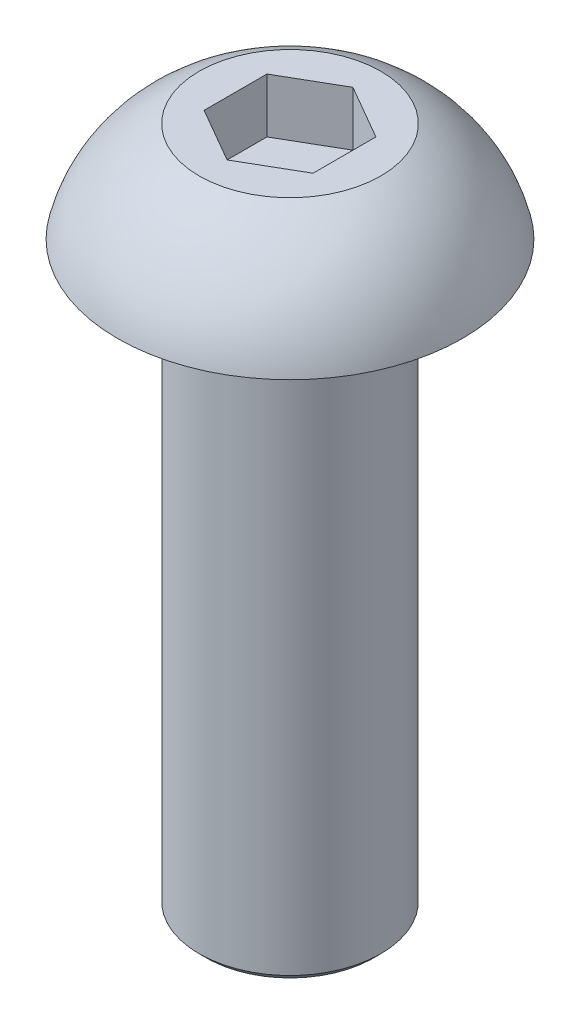
ISO-10303-21;
HEADER;
FILE_DESCRIPTION(('STEP AP214'),'2;1');
FILE_NAME('part.step','',(''),(''),'','','');
FILE_SCHEMA(('AUTOMOTIVE_DESIGN { 1 0 10303 214 1 1 1 1 }'));
ENDSEC;
DATA;
#1=APPLICATION_CONTEXT('core data for automotive mechanical design processes');
#2=APPLICATION_PROTOCOL_DEFINITION('international standard','automotive_design',2000,#1);
#3=PRODUCT_CONTEXT('',#1,'mechanical');
#4=PRODUCT('Part','Part','',(#3));
#5=PRODUCT_RELATED_PRODUCT_CATEGORY('part','',(#4));
#6=PRODUCT_DEFINITION_FORMATION('','',#4);
#7=PRODUCT_DEFINITION_CONTEXT('part definition',#1,'design');
#8=PRODUCT_DEFINITION('design','',#6,#7);
#9=PRODUCT_DEFINITION_SHAPE('','',#8);
#10=(LENGTH_UNIT() NAMED_UNIT(*) SI_UNIT(.MILLI.,.METRE.));
#11=(NAMED_UNIT(*) PLANE_ANGLE_UNIT() SI_UNIT($,.RADIAN.));
#12=(NAMED_UNIT(*) SI_UNIT($,.STERADIAN.) SOLID_ANGLE_UNIT());
#13=UNCERTAINTY_MEASURE_WITH_UNIT(LENGTH_MEASURE(1.E-05),#10,'distance_accuracy_value','');
#14=(GEOMETRIC_REPRESENTATION_CONTEXT(3) GLOBAL_UNCERTAINTY_ASSIGNED_CONTEXT((#13)) GLOBAL_UNIT_ASSIGNED_CONTEXT((#10,
#11,#12)) REPRESENTATION_CONTEXT('',''));
#15=CARTESIAN_POINT('',(0.,0.,0.));
#16=DIRECTION('',(0.,0.,1.));
#17=DIRECTION('',(1.,0.,0.));
#18=AXIS2_PLACEMENT_3D('',#15,#16,#17);
#19=CARTESIAN_POINT('',(0.,2.75,0.));
#20=DIRECTION('',(0.,1.,0.));
#21=DIRECTION('',(0.,0.,1.));
#22=AXIS2_PLACEMENT_3D('',#19,#20,#21);
#23=PLANE('',#22);
#24=DIRECTION('',(-0.866025403784439,0.,0.5));
#25=VECTOR('',#24,1.);
#26=CARTESIAN_POINT('',(0.,2.75,-1.73205080756887));
#27=LINE('',#26,#25);
#28=CARTESIAN_POINT('',(0.,2.75,-1.73205080756887));
#29=VERTEX_POINT('',#28);
#30=CARTESIAN_POINT('',(-1.5,2.75,-0.866025403784439));
#31=VERTEX_POINT('',#30);
#32=EDGE_CURVE('E32',#29,#31,#27,.T.);
#33=ORIENTED_EDGE('',*,*,#32,.F.);
#34=DIRECTION('',(-0.866025403784439,0.,-0.5));
#35=VECTOR('',#34,1.);
#36=CARTESIAN_POINT('',(1.5,2.75,-0.866025403784439));
#37=LINE('',#36,#35);
#38=CARTESIAN_POINT('',(1.5,2.75,-0.866025403784439));
#39=VERTEX_POINT('',#38);
#40=EDGE_CURVE('E115',#39,#29,#37,.T.);
#41=ORIENTED_EDGE('',*,*,#40,.F.);
#42=DIRECTION('',(0.,0.,-1.));
#43=VECTOR('',#42,1.);
#44=CARTESIAN_POINT('',(1.5,2.75,0.866025403784438));
#45=LINE('',#44,#43);
#46=CARTESIAN_POINT('',(1.5,2.75,0.866025403784438));
#47=VERTEX_POINT('',#46);
#48=EDGE_CURVE('E113',#47,#39,#45,.T.);
#49=ORIENTED_EDGE('',*,*,#48,.F.);
#50=DIRECTION('',(0.866025403784439,0.,-0.5));
#51=VECTOR('',#50,1.);
#52=CARTESIAN_POINT('',(0.,2.75,1.73205080756887));
#53=LINE('',#52,#51);
#54=CARTESIAN_POINT('',(0.,2.75,1.73205080756887));
#55=VERTEX_POINT('',#54);
#56=EDGE_CURVE('E80',#55,#47,#53,.T.);
#57=ORIENTED_EDGE('',*,*,#56,.F.);
#58=DIRECTION('',(0.866025403784439,0.,0.5));
#59=VECTOR('',#58,1.);
#60=CARTESIAN_POINT('',(-1.5,2.75,0.866025403784439));
#61=LINE('',#60,#59);
#62=CARTESIAN_POINT('',(-1.5,2.75,0.866025403784439));
#63=VERTEX_POINT('',#62);
#64=EDGE_CURVE('E109',#63,#55,#61,.T.);
#65=ORIENTED_EDGE('',*,*,#64,.F.);
#66=DIRECTION('',(0.,0.,1.));
#67=VECTOR('',#66,1.);
#68=CARTESIAN_POINT('',(-1.5,2.75,-0.866025403784439));
#69=LINE('',#68,#67);
#70=EDGE_CURVE('E106',#31,#63,#69,.T.);
#71=ORIENTED_EDGE('',*,*,#70,.F.);
#72=EDGE_LOOP('',(#33,#41,#49,#57,#65,#71));
#73=FACE_BOUND('',#72,.T.);
#74=CARTESIAN_POINT('',(0.,2.75,0.));
#75=DIRECTION('',(0.,1.,0.));
#76=DIRECTION('',(0.,0.,1.));
#77=AXIS2_PLACEMENT_3D('',#74,#75,#76);
#78=CIRCLE('',#77,2.5);
#79=CARTESIAN_POINT('',(0.,2.75,2.5));
#80=VERTEX_POINT('',#79);
#81=EDGE_CURVE('E130',#80,#80,#78,.T.);
#82=ORIENTED_EDGE('',*,*,#81,.T.);
#83=EDGE_LOOP('',(#82));
#84=FACE_BOUND('',#83,.T.);
#85=ADVANCED_FACE('F17',(#73,#84),#23,.T.);
#86=CARTESIAN_POINT('',(0.,-0.894408862271936,0.));
#87=DIRECTION('',(0.,1.,0.));
#88=DIRECTION('',(0.,0.,1.));
#89=AXIS2_PLACEMENT_3D('',#86,#87,#88);
#90=DEGENERATE_TOROIDAL_SURFACE('',#89,0.851278057223178,4.,.T.);
#91=CARTESIAN_POINT('',(0.,0.,0.));
#92=DIRECTION('',(0.,1.,0.));
#93=DIRECTION('',(0.,0.,1.));
#94=AXIS2_PLACEMENT_3D('',#91,#92,#93);
#95=CIRCLE('',#94,4.75);
#96=CARTESIAN_POINT('',(0.,0.,4.75));
#97=VERTEX_POINT('',#96);
#98=EDGE_CURVE('E127',#97,#97,#95,.T.);
#99=ORIENTED_EDGE('',*,*,#98,.T.);
#100=EDGE_LOOP('',(#99));
#101=FACE_BOUND('',#100,.T.);
#102=ORIENTED_EDGE('',*,*,#81,.F.);
#103=EDGE_LOOP('',(#102));
#104=FACE_BOUND('',#103,.T.);
#105=ADVANCED_FACE('F149',(#101,#104),#90,.T.);
#106=CARTESIAN_POINT('',(-2.5,0.,0.));
#107=DIRECTION('',(0.,-1.,0.));
#108=DIRECTION('',(0.,0.,-1.));
#109=AXIS2_PLACEMENT_3D('',#106,#107,#108);
#110=PLANE('',#109);
#111=CARTESIAN_POINT('',(0.,0.,0.));
#112=DIRECTION('',(0.,1.,0.));
#113=DIRECTION('',(0.,0.,1.));
#114=AXIS2_PLACEMENT_3D('',#111,#112,#113);
#115=CIRCLE('',#114,2.5);
#116=CARTESIAN_POINT('',(0.,0.,2.5));
#117=VERTEX_POINT('',#116);
#118=EDGE_CURVE('E119',#117,#117,#115,.T.);
#119=ORIENTED_EDGE('',*,*,#118,.T.);
#120=EDGE_LOOP('',(#119));
#121=FACE_BOUND('',#120,.T.);
#122=ORIENTED_EDGE('',*,*,#98,.F.);
#123=EDGE_LOOP('',(#122));
#124=FACE_BOUND('',#123,.T.);
#125=ADVANCED_FACE('F155',(#121,#124),#110,.T.);
#126=CARTESIAN_POINT('',(0.,60.1595545799248,0.));
#127=DIRECTION('',(0.,1.,0.));
#128=DIRECTION('',(0.,0.,1.));
#129=AXIS2_PLACEMENT_3D('',#126,#127,#128);
#130=CYLINDRICAL_SURFACE('',#129,2.5);
#131=CARTESIAN_POINT('',(0.,-15.8,0.));
#132=DIRECTION('',(0.,-1.,0.));
#133=DIRECTION('',(0.,0.,-1.));
#134=AXIS2_PLACEMENT_3D('',#131,#132,#133);
#135=CIRCLE('',#134,2.5);
#136=CARTESIAN_POINT('',(0.,-15.8,-2.5));
#137=VERTEX_POINT('',#136);
#138=EDGE_CURVE('E25',#137,#137,#135,.F.);
#139=ORIENTED_EDGE('',*,*,#138,.T.);
#140=EDGE_LOOP('',(#139));
#141=FACE_BOUND('',#140,.T.);
#142=ORIENTED_EDGE('',*,*,#118,.F.);
#143=EDGE_LOOP('',(#142));
#144=FACE_BOUND('',#143,.T.);
#145=ADVANCED_FACE('F135',(#141,#144),#130,.T.);
#146=CARTESIAN_POINT('',(0.,-16.,0.));
#147=DIRECTION('',(0.,-1.,0.));
#148=DIRECTION('',(0.,0.,-1.));
#149=AXIS2_PLACEMENT_3D('',#146,#147,#148);
#150=PLANE('',#149);
#151=CARTESIAN_POINT('',(0.,-16.,0.));
#152=DIRECTION('',(0.,-1.,0.));
#153=DIRECTION('',(0.,0.,-1.));
#154=AXIS2_PLACEMENT_3D('',#151,#152,#153);
#155=CIRCLE('',#154,2.3);
#156=CARTESIAN_POINT('',(0.,-16.,-2.3));
#157=VERTEX_POINT('',#156);
#158=EDGE_CURVE('E11',#157,#157,#155,.T.);
#159=ORIENTED_EDGE('',*,*,#158,.T.);
#160=EDGE_LOOP('',(#159));
#161=FACE_BOUND('',#160,.T.);
#162=ADVANCED_FACE('F165',(#161),#150,.T.);
#163=CARTESIAN_POINT('',(0.,1.25,-1.73205080756887));
#164=DIRECTION('',(-0.5,0.,-0.866025403784439));
#165=DIRECTION('',(-0.866025403784439,0.,0.5));
#166=AXIS2_PLACEMENT_3D('',#163,#164,#165);
#167=PLANE('',#166);
#168=ORIENTED_EDGE('',*,*,#32,.T.);
#169=DIRECTION('',(0.,1.,0.));
#170=VECTOR('',#169,1.);
#171=CARTESIAN_POINT('',(-1.5,1.25,-0.866025403784439));
#172=LINE('',#171,#170);
#173=CARTESIAN_POINT('',(-1.5,1.25,-0.866025403784439));
#174=VERTEX_POINT('',#173);
#175=EDGE_CURVE('E62',#174,#31,#172,.T.);
#176=ORIENTED_EDGE('',*,*,#175,.F.);
#177=DIRECTION('',(-0.866025403784439,0.,0.5));
#178=VECTOR('',#177,1.);
#179=CARTESIAN_POINT('',(0.,1.25,-1.73205080756887));
#180=LINE('',#179,#178);
#181=CARTESIAN_POINT('',(0.,1.25,-1.73205080756887));
#182=VERTEX_POINT('',#181);
#183=EDGE_CURVE('E117',#182,#174,#180,.T.);
#184=ORIENTED_EDGE('',*,*,#183,.F.);
#185=DIRECTION('',(0.,1.,0.));
#186=VECTOR('',#185,1.);
#187=CARTESIAN_POINT('',(0.,1.25,-1.73205080756887));
#188=LINE('',#187,#186);
#189=EDGE_CURVE('E40',#182,#29,#188,.T.);
#190=ORIENTED_EDGE('',*,*,#189,.T.);
#191=EDGE_LOOP('',(#168,#176,#184,#190));
#192=FACE_BOUND('',#191,.T.);
#193=ADVANCED_FACE('F168',(#192),#167,.F.);
#194=CARTESIAN_POINT('',(1.5,1.25,-0.866025403784439));
#195=DIRECTION('',(0.5,0.,-0.866025403784439));
#196=DIRECTION('',(-0.866025403784439,0.,-0.5));
#197=AXIS2_PLACEMENT_3D('',#194,#195,#196);
#198=PLANE('',#197);
#199=ORIENTED_EDGE('',*,*,#40,.T.);
#200=ORIENTED_EDGE('',*,*,#189,.F.);
#201=DIRECTION('',(-0.866025403784439,0.,-0.5));
#202=VECTOR('',#201,1.);
#203=CARTESIAN_POINT('',(1.5,1.25,-0.866025403784439));
#204=LINE('',#203,#202);
#205=CARTESIAN_POINT('',(1.5,1.25,-0.866025403784439));
#206=VERTEX_POINT('',#205);
#207=EDGE_CURVE('E92',#206,#182,#204,.T.);
#208=ORIENTED_EDGE('',*,*,#207,.F.);
#209=DIRECTION('',(0.,1.,0.));
#210=VECTOR('',#209,1.);
#211=CARTESIAN_POINT('',(1.5,1.25,-0.866025403784439));
#212=LINE('',#211,#210);
#213=EDGE_CURVE('E84',#206,#39,#212,.T.);
#214=ORIENTED_EDGE('',*,*,#213,.T.);
#215=EDGE_LOOP('',(#199,#200,#208,#214));
#216=FACE_BOUND('',#215,.T.);
#217=ADVANCED_FACE('F172',(#216),#198,.F.);
#218=CARTESIAN_POINT('',(1.5,1.25,0.866025403784438));
#219=DIRECTION('',(1.,0.,0.));
#220=DIRECTION('',(0.,0.,-1.));
#221=AXIS2_PLACEMENT_3D('',#218,#219,#220);
#222=PLANE('',#221);
#223=ORIENTED_EDGE('',*,*,#48,.T.);
#224=ORIENTED_EDGE('',*,*,#213,.F.);
#225=DIRECTION('',(0.,0.,-1.));
#226=VECTOR('',#225,1.);
#227=CARTESIAN_POINT('',(1.5,1.25,0.866025403784438));
#228=LINE('',#227,#226);
#229=CARTESIAN_POINT('',(1.5,1.25,0.866025403784438));
#230=VERTEX_POINT('',#229);
#231=EDGE_CURVE('E88',#230,#206,#228,.T.);
#232=ORIENTED_EDGE('',*,*,#231,.F.);
#233=DIRECTION('',(0.,1.,0.));
#234=VECTOR('',#233,1.);
#235=CARTESIAN_POINT('',(1.5,1.25,0.866025403784438));
#236=LINE('',#235,#234);
#237=EDGE_CURVE('E73',#230,#47,#236,.T.);
#238=ORIENTED_EDGE('',*,*,#237,.T.);
#239=EDGE_LOOP('',(#223,#224,#232,#238));
#240=FACE_BOUND('',#239,.T.);
#241=ADVANCED_FACE('F89',(#240),#222,.F.);
#242=CARTESIAN_POINT('',(0.,1.25,1.73205080756887));
#243=DIRECTION('',(0.5,0.,0.866025403784438));
#244=DIRECTION('',(0.866025403784439,0.,-0.5));
#245=AXIS2_PLACEMENT_3D('',#242,#243,#244);
#246=PLANE('',#245);
#247=ORIENTED_EDGE('',*,*,#56,.T.);
#248=ORIENTED_EDGE('',*,*,#237,.F.);
#249=DIRECTION('',(0.866025403784439,0.,-0.5));
#250=VECTOR('',#249,1.);
#251=CARTESIAN_POINT('',(0.,1.25,1.73205080756887));
#252=LINE('',#251,#250);
#253=CARTESIAN_POINT('',(0.,1.25,1.73205080756887));
#254=VERTEX_POINT('',#253);
#255=EDGE_CURVE('E77',#254,#230,#252,.T.);
#256=ORIENTED_EDGE('',*,*,#255,.F.);
#257=DIRECTION('',(0.,1.,0.));
#258=VECTOR('',#257,1.);
#259=CARTESIAN_POINT('',(0.,1.25,1.73205080756887));
#260=LINE('',#259,#258);
#261=EDGE_CURVE('E85',#254,#55,#260,.T.);
#262=ORIENTED_EDGE('',*,*,#261,.T.);
#263=EDGE_LOOP('',(#247,#248,#256,#262));
#264=FACE_BOUND('',#263,.T.);
#265=ADVANCED_FACE('F75',(#264),#246,.F.);
#266=CARTESIAN_POINT('',(-1.5,1.25,0.866025403784439));
#267=DIRECTION('',(-0.5,0.,0.866025403784439));
#268=DIRECTION('',(0.866025403784439,0.,0.5));
#269=AXIS2_PLACEMENT_3D('',#266,#267,#268);
#270=PLANE('',#269);
#271=ORIENTED_EDGE('',*,*,#64,.T.);
#272=ORIENTED_EDGE('',*,*,#261,.F.);
#273=DIRECTION('',(0.866025403784439,0.,0.5));
#274=VECTOR('',#273,1.);
#275=CARTESIAN_POINT('',(-1.5,1.25,0.866025403784439));
#276=LINE('',#275,#274);
#277=CARTESIAN_POINT('',(-1.5,1.25,0.866025403784439));
#278=VERTEX_POINT('',#277);
#279=EDGE_CURVE('E98',#278,#254,#276,.T.);
#280=ORIENTED_EDGE('',*,*,#279,.F.);
#281=DIRECTION('',(0.,1.,0.));
#282=VECTOR('',#281,1.);
#283=CARTESIAN_POINT('',(-1.5,1.25,0.866025403784439));
#284=LINE('',#283,#282);
#285=EDGE_CURVE('E122',#278,#63,#284,.T.);
#286=ORIENTED_EDGE('',*,*,#285,.T.);
#287=EDGE_LOOP('',(#271,#272,#280,#286));
#288=FACE_BOUND('',#287,.T.);
#289=ADVANCED_FACE('F175',(#288),#270,.F.);
#290=CARTESIAN_POINT('',(-1.5,1.25,-0.866025403784439));
#291=DIRECTION('',(-1.,0.,0.));
#292=DIRECTION('',(0.,0.,1.));
#293=AXIS2_PLACEMENT_3D('',#290,#291,#292);
#294=PLANE('',#293);
#295=ORIENTED_EDGE('',*,*,#70,.T.);
#296=ORIENTED_EDGE('',*,*,#285,.F.);
#297=DIRECTION('',(0.,0.,1.));
#298=VECTOR('',#297,1.);
#299=CARTESIAN_POINT('',(-1.5,1.25,-0.866025403784439));
#300=LINE('',#299,#298);
#301=EDGE_CURVE('E100',#174,#278,#300,.T.);
#302=ORIENTED_EDGE('',*,*,#301,.F.);
#303=ORIENTED_EDGE('',*,*,#175,.T.);
#304=EDGE_LOOP('',(#295,#296,#302,#303));
#305=FACE_BOUND('',#304,.T.);
#306=ADVANCED_FACE('F145',(#305),#294,.F.);
#307=CARTESIAN_POINT('',(0.,1.25,0.));
#308=DIRECTION('',(0.,1.,0.));
#309=DIRECTION('',(0.,0.,1.));
#310=AXIS2_PLACEMENT_3D('',#307,#308,#309);
#311=PLANE('',#310);
#312=ORIENTED_EDGE('',*,*,#183,.T.);
#313=ORIENTED_EDGE('',*,*,#301,.T.);
#314=ORIENTED_EDGE('',*,*,#279,.T.);
#315=ORIENTED_EDGE('',*,*,#255,.T.);
#316=ORIENTED_EDGE('',*,*,#231,.T.);
#317=ORIENTED_EDGE('',*,*,#207,.T.);
#318=EDGE_LOOP('',(#312,#313,#314,#315,#316,#317));
#319=FACE_BOUND('',#318,.T.);
#320=ADVANCED_FACE('F95',(#319),#311,.T.);
#321=CARTESIAN_POINT('',(0.,-15.8,0.));
#322=DIRECTION('',(0.,1.,0.));
#323=DIRECTION('',(0.,0.,1.));
#324=AXIS2_PLACEMENT_3D('',#321,#322,#323);
#325=CONICAL_SURFACE('',#324,2.5,0.785398163397456);
#326=ORIENTED_EDGE('',*,*,#158,.F.);
#327=EDGE_LOOP('',(#326));
#328=FACE_BOUND('',#327,.T.);
#329=ORIENTED_EDGE('',*,*,#138,.F.);
#330=EDGE_LOOP('',(#329));
#331=FACE_BOUND('',#330,.T.);
#332=ADVANCED_FACE('F19',(#328,#331),#325,.T.);
#333=CLOSED_SHELL('',(#85,#105,#125,#145,#162,#193,#217,#241,#265,#289,#306,#320,#332));
#334=MANIFOLD_SOLID_BREP('B1',#333);
#335=ADVANCED_BREP_SHAPE_REPRESENTATION('',(#18,#334),#14);
#336=SHAPE_DEFINITION_REPRESENTATION(#9,#335);
ENDSEC;
END-ISO-10303-21;
